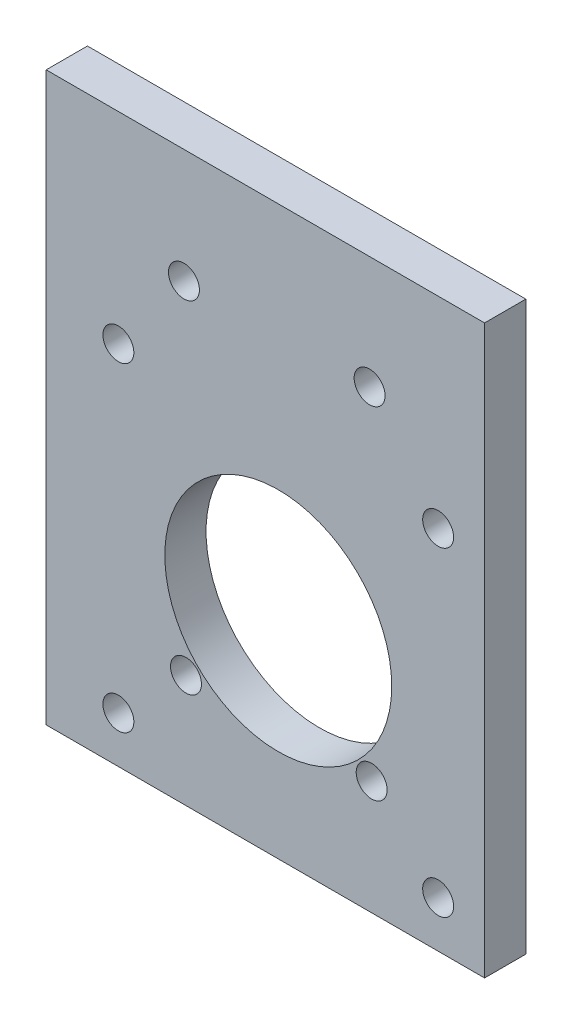
ISO-10303-21;
HEADER;
FILE_DESCRIPTION(('STEP AP214'),'2;1');
FILE_NAME('part.step','',(''),(''),'','','');
FILE_SCHEMA(('AUTOMOTIVE_DESIGN { 1 0 10303 214 1 1 1 1 }'));
ENDSEC;
DATA;
#1=APPLICATION_CONTEXT('core data for automotive mechanical design processes');
#2=APPLICATION_PROTOCOL_DEFINITION('international standard','automotive_design',2000,#1);
#3=PRODUCT_CONTEXT('',#1,'mechanical');
#4=PRODUCT('Part','Part','',(#3));
#5=PRODUCT_RELATED_PRODUCT_CATEGORY('part','',(#4));
#6=PRODUCT_DEFINITION_FORMATION('','',#4);
#7=PRODUCT_DEFINITION_CONTEXT('part definition',#1,'design');
#8=PRODUCT_DEFINITION('design','',#6,#7);
#9=PRODUCT_DEFINITION_SHAPE('','',#8);
#10=(LENGTH_UNIT() NAMED_UNIT(*) SI_UNIT(.MILLI.,.METRE.));
#11=(NAMED_UNIT(*) PLANE_ANGLE_UNIT() SI_UNIT($,.RADIAN.));
#12=(NAMED_UNIT(*) SI_UNIT($,.STERADIAN.) SOLID_ANGLE_UNIT());
#13=UNCERTAINTY_MEASURE_WITH_UNIT(LENGTH_MEASURE(1.E-05),#10,'distance_accuracy_value','');
#14=(GEOMETRIC_REPRESENTATION_CONTEXT(3) GLOBAL_UNCERTAINTY_ASSIGNED_CONTEXT((#13)) GLOBAL_UNIT_ASSIGNED_CONTEXT((#10,
#11,#12)) REPRESENTATION_CONTEXT('',''));
#15=CARTESIAN_POINT('',(0.,0.,0.));
#16=DIRECTION('',(0.,0.,1.));
#17=DIRECTION('',(1.,0.,0.));
#18=AXIS2_PLACEMENT_3D('',#15,#16,#17);
#19=CARTESIAN_POINT('',(21.25,20.,2.));
#20=DIRECTION('',(-1.,0.,0.));
#21=DIRECTION('',(0.,0.,1.));
#22=AXIS2_PLACEMENT_3D('',#19,#20,#21);
#23=PLANE('',#22);
#24=DIRECTION('',(0.,1.,0.));
#25=VECTOR('',#24,1.);
#26=CARTESIAN_POINT('',(21.25,20.,-2.));
#27=LINE('',#26,#25);
#28=CARTESIAN_POINT('',(21.25,-20.,-2.));
#29=VERTEX_POINT('',#28);
#30=CARTESIAN_POINT('',(21.25,35.,-2.));
#31=VERTEX_POINT('',#30);
#32=EDGE_CURVE('E148',#29,#31,#27,.T.);
#33=ORIENTED_EDGE('',*,*,#32,.T.);
#34=DIRECTION('',(0.,0.,-1.));
#35=VECTOR('',#34,1.);
#36=CARTESIAN_POINT('',(21.25,35.,-2.));
#37=LINE('',#36,#35);
#38=CARTESIAN_POINT('',(21.25,35.,2.));
#39=VERTEX_POINT('',#38);
#40=EDGE_CURVE('E107',#39,#31,#37,.T.);
#41=ORIENTED_EDGE('',*,*,#40,.F.);
#42=DIRECTION('',(0.,1.,0.));
#43=VECTOR('',#42,1.);
#44=CARTESIAN_POINT('',(21.25,20.,2.));
#45=LINE('',#44,#43);
#46=CARTESIAN_POINT('',(21.25,-20.,2.));
#47=VERTEX_POINT('',#46);
#48=EDGE_CURVE('E98',#47,#39,#45,.T.);
#49=ORIENTED_EDGE('',*,*,#48,.F.);
#50=DIRECTION('',(0.,0.,-1.));
#51=VECTOR('',#50,1.);
#52=CARTESIAN_POINT('',(21.25,-20.,2.));
#53=LINE('',#52,#51);
#54=EDGE_CURVE('E59',#47,#29,#53,.T.);
#55=ORIENTED_EDGE('',*,*,#54,.T.);
#56=EDGE_LOOP('',(#33,#41,#49,#55));
#57=FACE_BOUND('',#56,.T.);
#58=ADVANCED_FACE('F50',(#57),#23,.F.);
#59=CARTESIAN_POINT('',(-21.25,20.,2.));
#60=DIRECTION('',(1.,0.,0.));
#61=DIRECTION('',(0.,1.,0.));
#62=AXIS2_PLACEMENT_3D('',#59,#60,#61);
#63=PLANE('',#62);
#64=DIRECTION('',(0.,-1.,0.));
#65=VECTOR('',#64,1.);
#66=CARTESIAN_POINT('',(-21.25,20.,-2.));
#67=LINE('',#66,#65);
#68=CARTESIAN_POINT('',(-21.25,35.,-2.));
#69=VERTEX_POINT('',#68);
#70=CARTESIAN_POINT('',(-21.25,-20.,-2.));
#71=VERTEX_POINT('',#70);
#72=EDGE_CURVE('E79',#69,#71,#67,.T.);
#73=ORIENTED_EDGE('',*,*,#72,.T.);
#74=DIRECTION('',(0.,0.,-1.));
#75=VECTOR('',#74,1.);
#76=CARTESIAN_POINT('',(-21.25,-20.,2.));
#77=LINE('',#76,#75);
#78=CARTESIAN_POINT('',(-21.25,-20.,2.));
#79=VERTEX_POINT('',#78);
#80=EDGE_CURVE('E13',#79,#71,#77,.T.);
#81=ORIENTED_EDGE('',*,*,#80,.F.);
#82=DIRECTION('',(0.,-1.,0.));
#83=VECTOR('',#82,1.);
#84=CARTESIAN_POINT('',(-21.25,20.,2.));
#85=LINE('',#84,#83);
#86=CARTESIAN_POINT('',(-21.25,35.,2.));
#87=VERTEX_POINT('',#86);
#88=EDGE_CURVE('E93',#87,#79,#85,.T.);
#89=ORIENTED_EDGE('',*,*,#88,.F.);
#90=DIRECTION('',(0.,0.,1.));
#91=VECTOR('',#90,1.);
#92=CARTESIAN_POINT('',(-21.25,35.,-2.));
#93=LINE('',#92,#91);
#94=EDGE_CURVE('E97',#69,#87,#93,.T.);
#95=ORIENTED_EDGE('',*,*,#94,.F.);
#96=EDGE_LOOP('',(#73,#81,#89,#95));
#97=FACE_BOUND('',#96,.T.);
#98=ADVANCED_FACE('F95',(#97),#63,.F.);
#99=CARTESIAN_POINT('',(-21.25,-20.,2.));
#100=DIRECTION('',(0.,1.,0.));
#101=DIRECTION('',(0.,0.,1.));
#102=AXIS2_PLACEMENT_3D('',#99,#100,#101);
#103=PLANE('',#102);
#104=DIRECTION('',(1.,0.,0.));
#105=VECTOR('',#104,1.);
#106=CARTESIAN_POINT('',(-21.25,-20.,-2.));
#107=LINE('',#106,#105);
#108=EDGE_CURVE('E151',#71,#29,#107,.T.);
#109=ORIENTED_EDGE('',*,*,#108,.T.);
#110=ORIENTED_EDGE('',*,*,#54,.F.);
#111=DIRECTION('',(1.,0.,0.));
#112=VECTOR('',#111,1.);
#113=CARTESIAN_POINT('',(-21.25,-20.,2.));
#114=LINE('',#113,#112);
#115=EDGE_CURVE('E68',#79,#47,#114,.T.);
#116=ORIENTED_EDGE('',*,*,#115,.F.);
#117=ORIENTED_EDGE('',*,*,#80,.T.);
#118=EDGE_LOOP('',(#109,#110,#116,#117));
#119=FACE_BOUND('',#118,.T.);
#120=ADVANCED_FACE('F191',(#119),#103,.F.);
#121=CARTESIAN_POINT('',(0.,0.,2.));
#122=DIRECTION('',(0.,0.,1.));
#123=DIRECTION('',(1.,0.,0.));
#124=AXIS2_PLACEMENT_3D('',#121,#122,#123);
#125=PLANE('',#124);
#126=CARTESIAN_POINT('',(-7.69577181131252,-9.05390339576949,2.));
#127=DIRECTION('',(0.,0.,1.));
#128=DIRECTION('',(1.,0.,0.));
#129=AXIS2_PLACEMENT_3D('',#126,#127,#128);
#130=CIRCLE('',#129,1.5);
#131=CARTESIAN_POINT('',(-6.19577181131252,-9.05390339576949,2.));
#132=VERTEX_POINT('',#131);
#133=EDGE_CURVE('E361',#132,#132,#130,.T.);
#134=ORIENTED_EDGE('',*,*,#133,.F.);
#135=EDGE_LOOP('',(#134));
#136=FACE_BOUND('',#135,.T.);
#137=CARTESIAN_POINT('',(10.3039033957695,-8.94577181131251,2.));
#138=DIRECTION('',(0.,0.,1.));
#139=DIRECTION('',(1.,0.,0.));
#140=AXIS2_PLACEMENT_3D('',#137,#138,#139);
#141=CIRCLE('',#140,1.5);
#142=CARTESIAN_POINT('',(11.8039033957695,-8.94577181131251,2.));
#143=VERTEX_POINT('',#142);
#144=EDGE_CURVE('E358',#143,#143,#141,.T.);
#145=ORIENTED_EDGE('',*,*,#144,.F.);
#146=EDGE_LOOP('',(#145));
#147=FACE_BOUND('',#146,.T.);
#148=CARTESIAN_POINT('',(10.1056621575984,24.0536327350045,2.));
#149=DIRECTION('',(0.,0.,1.));
#150=DIRECTION('',(1.,0.,0.));
#151=AXIS2_PLACEMENT_3D('',#148,#149,#150);
#152=CIRCLE('',#151,1.5);
#153=CARTESIAN_POINT('',(11.6056621575984,24.0536327350045,2.));
#154=VERTEX_POINT('',#153);
#155=EDGE_CURVE('E356',#154,#154,#152,.T.);
#156=ORIENTED_EDGE('',*,*,#155,.F.);
#157=EDGE_LOOP('',(#156));
#158=FACE_BOUND('',#157,.T.);
#159=CARTESIAN_POINT('',(-7.89401304948366,23.9455011505475,2.));
#160=DIRECTION('',(0.,0.,1.));
#161=DIRECTION('',(1.,0.,0.));
#162=AXIS2_PLACEMENT_3D('',#159,#160,#161);
#163=CIRCLE('',#162,1.5);
#164=CARTESIAN_POINT('',(-6.39401304948366,23.9455011505475,2.));
#165=VERTEX_POINT('',#164);
#166=EDGE_CURVE('E115',#165,#165,#163,.T.);
#167=ORIENTED_EDGE('',*,*,#166,.F.);
#168=EDGE_LOOP('',(#167));
#169=FACE_BOUND('',#168,.T.);
#170=CARTESIAN_POINT('',(1.25,0.,2.));
#171=DIRECTION('',(0.,0.,1.));
#172=DIRECTION('',(1.,0.,0.));
#173=AXIS2_PLACEMENT_3D('',#170,#171,#172);
#174=CIRCLE('',#173,11.);
#175=CARTESIAN_POINT('',(12.25,0.,2.));
#176=VERTEX_POINT('',#175);
#177=EDGE_CURVE('E120',#176,#176,#174,.T.);
#178=ORIENTED_EDGE('',*,*,#177,.F.);
#179=EDGE_LOOP('',(#178));
#180=FACE_BOUND('',#179,.T.);
#181=CARTESIAN_POINT('',(16.75,-15.5,2.));
#182=DIRECTION('',(0.,0.,-1.));
#183=DIRECTION('',(-1.,0.,0.));
#184=AXIS2_PLACEMENT_3D('',#181,#182,#183);
#185=CIRCLE('',#184,1.5);
#186=CARTESIAN_POINT('',(15.25,-15.5,2.));
#187=VERTEX_POINT('',#186);
#188=EDGE_CURVE('E140',#187,#187,#185,.T.);
#189=ORIENTED_EDGE('',*,*,#188,.T.);
#190=EDGE_LOOP('',(#189));
#191=FACE_BOUND('',#190,.T.);
#192=CARTESIAN_POINT('',(-14.25,-15.5,2.));
#193=DIRECTION('',(0.,0.,-1.));
#194=DIRECTION('',(-1.,0.,0.));
#195=AXIS2_PLACEMENT_3D('',#192,#193,#194);
#196=CIRCLE('',#195,1.5);
#197=CARTESIAN_POINT('',(-15.75,-15.5,2.));
#198=VERTEX_POINT('',#197);
#199=EDGE_CURVE('E134',#198,#198,#196,.T.);
#200=ORIENTED_EDGE('',*,*,#199,.T.);
#201=EDGE_LOOP('',(#200));
#202=FACE_BOUND('',#201,.T.);
#203=CARTESIAN_POINT('',(-14.25,15.5,2.));
#204=DIRECTION('',(0.,0.,-1.));
#205=DIRECTION('',(-1.,0.,0.));
#206=AXIS2_PLACEMENT_3D('',#203,#204,#205);
#207=CIRCLE('',#206,1.5);
#208=CARTESIAN_POINT('',(-15.75,15.5,2.));
#209=VERTEX_POINT('',#208);
#210=EDGE_CURVE('E127',#209,#209,#207,.T.);
#211=ORIENTED_EDGE('',*,*,#210,.T.);
#212=EDGE_LOOP('',(#211));
#213=FACE_BOUND('',#212,.T.);
#214=CARTESIAN_POINT('',(16.75,15.5,2.));
#215=DIRECTION('',(0.,0.,-1.));
#216=DIRECTION('',(-1.,0.,0.));
#217=AXIS2_PLACEMENT_3D('',#214,#215,#216);
#218=CIRCLE('',#217,1.5);
#219=CARTESIAN_POINT('',(15.25,15.5,2.));
#220=VERTEX_POINT('',#219);
#221=EDGE_CURVE('E145',#220,#220,#218,.T.);
#222=ORIENTED_EDGE('',*,*,#221,.T.);
#223=EDGE_LOOP('',(#222));
#224=FACE_BOUND('',#223,.T.);
#225=ORIENTED_EDGE('',*,*,#48,.T.);
#226=DIRECTION('',(1.,0.,0.));
#227=VECTOR('',#226,1.);
#228=CARTESIAN_POINT('',(-21.25,35.,2.));
#229=LINE('',#228,#227);
#230=EDGE_CURVE('E101',#87,#39,#229,.T.);
#231=ORIENTED_EDGE('',*,*,#230,.F.);
#232=ORIENTED_EDGE('',*,*,#88,.T.);
#233=ORIENTED_EDGE('',*,*,#115,.T.);
#234=EDGE_LOOP('',(#225,#231,#232,#233));
#235=FACE_BOUND('',#234,.T.);
#236=ADVANCED_FACE('F102',(#136,#147,#158,#169,#180,#191,#202,#213,#224,#235),#125,.T.);
#237=CARTESIAN_POINT('',(0.,0.,-2.));
#238=DIRECTION('',(0.,0.,1.));
#239=DIRECTION('',(1.,0.,0.));
#240=AXIS2_PLACEMENT_3D('',#237,#238,#239);
#241=PLANE('',#240);
#242=CARTESIAN_POINT('',(-7.69577181131252,-9.05390339576949,-2.));
#243=DIRECTION('',(0.,0.,1.));
#244=DIRECTION('',(1.,0.,0.));
#245=AXIS2_PLACEMENT_3D('',#242,#243,#244);
#246=CIRCLE('',#245,1.5);
#247=CARTESIAN_POINT('',(-6.19577181131252,-9.05390339576949,-2.));
#248=VERTEX_POINT('',#247);
#249=EDGE_CURVE('E53',#248,#248,#246,.T.);
#250=ORIENTED_EDGE('',*,*,#249,.T.);
#251=EDGE_LOOP('',(#250));
#252=FACE_BOUND('',#251,.T.);
#253=CARTESIAN_POINT('',(10.3039033957695,-8.94577181131251,-2.));
#254=DIRECTION('',(0.,0.,1.));
#255=DIRECTION('',(1.,0.,0.));
#256=AXIS2_PLACEMENT_3D('',#253,#254,#255);
#257=CIRCLE('',#256,1.5);
#258=CARTESIAN_POINT('',(11.8039033957695,-8.94577181131251,-2.));
#259=VERTEX_POINT('',#258);
#260=EDGE_CURVE('E113',#259,#259,#257,.T.);
#261=ORIENTED_EDGE('',*,*,#260,.T.);
#262=EDGE_LOOP('',(#261));
#263=FACE_BOUND('',#262,.T.);
#264=CARTESIAN_POINT('',(10.1056621575984,24.0536327350045,-2.));
#265=DIRECTION('',(0.,0.,1.));
#266=DIRECTION('',(1.,0.,0.));
#267=AXIS2_PLACEMENT_3D('',#264,#265,#266);
#268=CIRCLE('',#267,1.5);
#269=CARTESIAN_POINT('',(11.6056621575984,24.0536327350045,-2.));
#270=VERTEX_POINT('',#269);
#271=EDGE_CURVE('E162',#270,#270,#268,.T.);
#272=ORIENTED_EDGE('',*,*,#271,.T.);
#273=EDGE_LOOP('',(#272));
#274=FACE_BOUND('',#273,.T.);
#275=CARTESIAN_POINT('',(-7.89401304948366,23.9455011505475,-2.));
#276=DIRECTION('',(0.,0.,1.));
#277=DIRECTION('',(1.,0.,0.));
#278=AXIS2_PLACEMENT_3D('',#275,#276,#277);
#279=CIRCLE('',#278,1.5);
#280=CARTESIAN_POINT('',(-6.39401304948366,23.9455011505475,-2.));
#281=VERTEX_POINT('',#280);
#282=EDGE_CURVE('E159',#281,#281,#279,.T.);
#283=ORIENTED_EDGE('',*,*,#282,.T.);
#284=EDGE_LOOP('',(#283));
#285=FACE_BOUND('',#284,.T.);
#286=CARTESIAN_POINT('',(1.25,0.,-2.));
#287=DIRECTION('',(0.,0.,1.));
#288=DIRECTION('',(1.,0.,0.));
#289=AXIS2_PLACEMENT_3D('',#286,#287,#288);
#290=CIRCLE('',#289,11.);
#291=CARTESIAN_POINT('',(12.25,0.,-2.));
#292=VERTEX_POINT('',#291);
#293=EDGE_CURVE('E121',#292,#292,#290,.T.);
#294=ORIENTED_EDGE('',*,*,#293,.T.);
#295=EDGE_LOOP('',(#294));
#296=FACE_BOUND('',#295,.T.);
#297=CARTESIAN_POINT('',(16.75,-15.5,-2.));
#298=DIRECTION('',(0.,0.,-1.));
#299=DIRECTION('',(-1.,0.,0.));
#300=AXIS2_PLACEMENT_3D('',#297,#298,#299);
#301=CIRCLE('',#300,1.5);
#302=CARTESIAN_POINT('',(15.25,-15.5,-2.));
#303=VERTEX_POINT('',#302);
#304=EDGE_CURVE('E124',#303,#303,#301,.T.);
#305=ORIENTED_EDGE('',*,*,#304,.F.);
#306=EDGE_LOOP('',(#305));
#307=FACE_BOUND('',#306,.T.);
#308=CARTESIAN_POINT('',(-14.25,-15.5,-2.));
#309=DIRECTION('',(0.,0.,-1.));
#310=DIRECTION('',(-1.,0.,0.));
#311=AXIS2_PLACEMENT_3D('',#308,#309,#310);
#312=CIRCLE('',#311,1.5);
#313=CARTESIAN_POINT('',(-15.75,-15.5,-2.));
#314=VERTEX_POINT('',#313);
#315=EDGE_CURVE('E137',#314,#314,#312,.T.);
#316=ORIENTED_EDGE('',*,*,#315,.F.);
#317=EDGE_LOOP('',(#316));
#318=FACE_BOUND('',#317,.T.);
#319=CARTESIAN_POINT('',(-14.25,15.5,-2.));
#320=DIRECTION('',(0.,0.,-1.));
#321=DIRECTION('',(-1.,0.,0.));
#322=AXIS2_PLACEMENT_3D('',#319,#320,#321);
#323=CIRCLE('',#322,1.5);
#324=CARTESIAN_POINT('',(-15.75,15.5,-2.));
#325=VERTEX_POINT('',#324);
#326=EDGE_CURVE('E131',#325,#325,#323,.T.);
#327=ORIENTED_EDGE('',*,*,#326,.F.);
#328=EDGE_LOOP('',(#327));
#329=FACE_BOUND('',#328,.T.);
#330=CARTESIAN_POINT('',(16.75,15.5,-2.));
#331=DIRECTION('',(0.,0.,-1.));
#332=DIRECTION('',(-1.,0.,0.));
#333=AXIS2_PLACEMENT_3D('',#330,#331,#332);
#334=CIRCLE('',#333,1.5);
#335=CARTESIAN_POINT('',(15.25,15.5,-2.));
#336=VERTEX_POINT('',#335);
#337=EDGE_CURVE('E130',#336,#336,#334,.T.);
#338=ORIENTED_EDGE('',*,*,#337,.F.);
#339=EDGE_LOOP('',(#338));
#340=FACE_BOUND('',#339,.T.);
#341=ORIENTED_EDGE('',*,*,#32,.F.);
#342=ORIENTED_EDGE('',*,*,#108,.F.);
#343=ORIENTED_EDGE('',*,*,#72,.F.);
#344=DIRECTION('',(-1.,0.,0.));
#345=VECTOR('',#344,1.);
#346=CARTESIAN_POINT('',(-21.25,35.,-2.));
#347=LINE('',#346,#345);
#348=EDGE_CURVE('E110',#31,#69,#347,.T.);
#349=ORIENTED_EDGE('',*,*,#348,.F.);
#350=EDGE_LOOP('',(#341,#342,#343,#349));
#351=FACE_BOUND('',#350,.T.);
#352=ADVANCED_FACE('F167',(#252,#263,#274,#285,#296,#307,#318,#329,#340,#351),#241,.F.);
#353=CARTESIAN_POINT('',(16.75,15.5,2.));
#354=DIRECTION('',(0.,0.,-1.));
#355=DIRECTION('',(-1.,0.,0.));
#356=AXIS2_PLACEMENT_3D('',#353,#354,#355);
#357=CYLINDRICAL_SURFACE('',#356,1.5);
#358=ORIENTED_EDGE('',*,*,#221,.F.);
#359=EDGE_LOOP('',(#358));
#360=FACE_BOUND('',#359,.T.);
#361=ORIENTED_EDGE('',*,*,#337,.T.);
#362=EDGE_LOOP('',(#361));
#363=FACE_BOUND('',#362,.T.);
#364=ADVANCED_FACE('F194',(#360,#363),#357,.F.);
#365=CARTESIAN_POINT('',(-14.25,15.5,2.));
#366=DIRECTION('',(0.,0.,-1.));
#367=DIRECTION('',(-1.,0.,0.));
#368=AXIS2_PLACEMENT_3D('',#365,#366,#367);
#369=CYLINDRICAL_SURFACE('',#368,1.5);
#370=ORIENTED_EDGE('',*,*,#210,.F.);
#371=EDGE_LOOP('',(#370));
#372=FACE_BOUND('',#371,.T.);
#373=ORIENTED_EDGE('',*,*,#326,.T.);
#374=EDGE_LOOP('',(#373));
#375=FACE_BOUND('',#374,.T.);
#376=ADVANCED_FACE('F201',(#372,#375),#369,.F.);
#377=CARTESIAN_POINT('',(-14.25,-15.5,2.));
#378=DIRECTION('',(0.,0.,-1.));
#379=DIRECTION('',(-1.,0.,0.));
#380=AXIS2_PLACEMENT_3D('',#377,#378,#379);
#381=CYLINDRICAL_SURFACE('',#380,1.5);
#382=ORIENTED_EDGE('',*,*,#199,.F.);
#383=EDGE_LOOP('',(#382));
#384=FACE_BOUND('',#383,.T.);
#385=ORIENTED_EDGE('',*,*,#315,.T.);
#386=EDGE_LOOP('',(#385));
#387=FACE_BOUND('',#386,.T.);
#388=ADVANCED_FACE('F273',(#384,#387),#381,.F.);
#389=CARTESIAN_POINT('',(16.75,-15.5,2.));
#390=DIRECTION('',(0.,0.,-1.));
#391=DIRECTION('',(-1.,0.,0.));
#392=AXIS2_PLACEMENT_3D('',#389,#390,#391);
#393=CYLINDRICAL_SURFACE('',#392,1.5);
#394=ORIENTED_EDGE('',*,*,#188,.F.);
#395=EDGE_LOOP('',(#394));
#396=FACE_BOUND('',#395,.T.);
#397=ORIENTED_EDGE('',*,*,#304,.T.);
#398=EDGE_LOOP('',(#397));
#399=FACE_BOUND('',#398,.T.);
#400=ADVANCED_FACE('F265',(#396,#399),#393,.F.);
#401=CARTESIAN_POINT('',(1.25,0.,-2.));
#402=DIRECTION('',(0.,0.,1.));
#403=DIRECTION('',(1.,0.,0.));
#404=AXIS2_PLACEMENT_3D('',#401,#402,#403);
#405=CYLINDRICAL_SURFACE('',#404,11.);
#406=ORIENTED_EDGE('',*,*,#293,.F.);
#407=EDGE_LOOP('',(#406));
#408=FACE_BOUND('',#407,.T.);
#409=ORIENTED_EDGE('',*,*,#177,.T.);
#410=EDGE_LOOP('',(#409));
#411=FACE_BOUND('',#410,.T.);
#412=ADVANCED_FACE('F260',(#408,#411),#405,.F.);
#413=CARTESIAN_POINT('',(0.,35.,0.));
#414=DIRECTION('',(0.,1.,0.));
#415=DIRECTION('',(0.,0.,1.));
#416=AXIS2_PLACEMENT_3D('',#413,#414,#415);
#417=PLANE('',#416);
#418=ORIENTED_EDGE('',*,*,#94,.T.);
#419=ORIENTED_EDGE('',*,*,#230,.T.);
#420=ORIENTED_EDGE('',*,*,#40,.T.);
#421=ORIENTED_EDGE('',*,*,#348,.T.);
#422=EDGE_LOOP('',(#418,#419,#420,#421));
#423=FACE_BOUND('',#422,.T.);
#424=ADVANCED_FACE('F109',(#423),#417,.T.);
#425=CARTESIAN_POINT('',(-7.89401304948366,23.9455011505475,-8.));
#426=DIRECTION('',(0.,0.,1.));
#427=DIRECTION('',(1.,0.,0.));
#428=AXIS2_PLACEMENT_3D('',#425,#426,#427);
#429=CYLINDRICAL_SURFACE('',#428,1.5);
#430=ORIENTED_EDGE('',*,*,#166,.T.);
#431=EDGE_LOOP('',(#430));
#432=FACE_BOUND('',#431,.T.);
#433=ORIENTED_EDGE('',*,*,#282,.F.);
#434=EDGE_LOOP('',(#433));
#435=FACE_BOUND('',#434,.T.);
#436=ADVANCED_FACE('F182',(#432,#435),#429,.F.);
#437=CARTESIAN_POINT('',(10.1056621575984,24.0536327350045,-8.));
#438=DIRECTION('',(0.,0.,1.));
#439=DIRECTION('',(1.,0.,0.));
#440=AXIS2_PLACEMENT_3D('',#437,#438,#439);
#441=CYLINDRICAL_SURFACE('',#440,1.5);
#442=ORIENTED_EDGE('',*,*,#155,.T.);
#443=EDGE_LOOP('',(#442));
#444=FACE_BOUND('',#443,.T.);
#445=ORIENTED_EDGE('',*,*,#271,.F.);
#446=EDGE_LOOP('',(#445));
#447=FACE_BOUND('',#446,.T.);
#448=ADVANCED_FACE('F173',(#444,#447),#441,.F.);
#449=CARTESIAN_POINT('',(10.3039033957695,-8.94577181131251,-8.));
#450=DIRECTION('',(0.,0.,1.));
#451=DIRECTION('',(1.,0.,0.));
#452=AXIS2_PLACEMENT_3D('',#449,#450,#451);
#453=CYLINDRICAL_SURFACE('',#452,1.5);
#454=ORIENTED_EDGE('',*,*,#144,.T.);
#455=EDGE_LOOP('',(#454));
#456=FACE_BOUND('',#455,.T.);
#457=ORIENTED_EDGE('',*,*,#260,.F.);
#458=EDGE_LOOP('',(#457));
#459=FACE_BOUND('',#458,.T.);
#460=ADVANCED_FACE('F170',(#456,#459),#453,.F.);
#461=CARTESIAN_POINT('',(-7.69577181131252,-9.05390339576949,-8.));
#462=DIRECTION('',(0.,0.,1.));
#463=DIRECTION('',(1.,0.,0.));
#464=AXIS2_PLACEMENT_3D('',#461,#462,#463);
#465=CYLINDRICAL_SURFACE('',#464,1.5);
#466=ORIENTED_EDGE('',*,*,#133,.T.);
#467=EDGE_LOOP('',(#466));
#468=FACE_BOUND('',#467,.T.);
#469=ORIENTED_EDGE('',*,*,#249,.F.);
#470=EDGE_LOOP('',(#469));
#471=FACE_BOUND('',#470,.T.);
#472=ADVANCED_FACE('F172',(#468,#471),#465,.F.);
#473=CLOSED_SHELL('',(#58,#98,#120,#236,#352,#364,#376,#388,#400,#412,#424,#436,#448,#460,#472));
#474=MANIFOLD_SOLID_BREP('B2',#473);
#475=ADVANCED_BREP_SHAPE_REPRESENTATION('',(#18,#474),#14);
#476=SHAPE_DEFINITION_REPRESENTATION(#9,#475);
ENDSEC;
END-ISO-10303-21;
